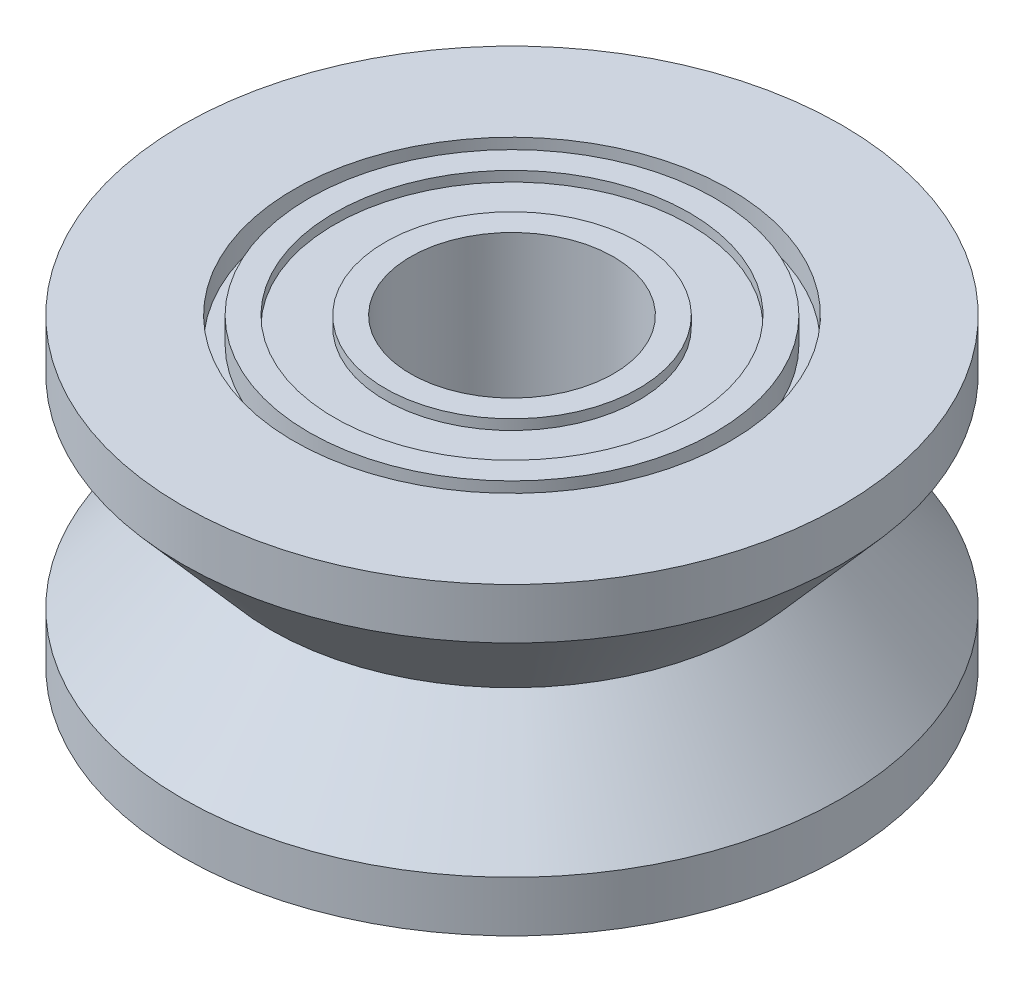
ISO-10303-21;
HEADER;
FILE_DESCRIPTION(('STEP AP214'),'2;1');
FILE_NAME('part.step','',(''),(''),'','','');
FILE_SCHEMA(('AUTOMOTIVE_DESIGN { 1 0 10303 214 1 1 1 1 }'));
ENDSEC;
DATA;
#1=APPLICATION_CONTEXT('core data for automotive mechanical design processes');
#2=APPLICATION_PROTOCOL_DEFINITION('international standard','automotive_design',2000,#1);
#3=PRODUCT_CONTEXT('',#1,'mechanical');
#4=PRODUCT('Part','Part','',(#3));
#5=PRODUCT_RELATED_PRODUCT_CATEGORY('part','',(#4));
#6=PRODUCT_DEFINITION_FORMATION('','',#4);
#7=PRODUCT_DEFINITION_CONTEXT('part definition',#1,'design');
#8=PRODUCT_DEFINITION('design','',#6,#7);
#9=PRODUCT_DEFINITION_SHAPE('','',#8);
#10=(LENGTH_UNIT() NAMED_UNIT(*) SI_UNIT(.MILLI.,.METRE.));
#11=(NAMED_UNIT(*) PLANE_ANGLE_UNIT() SI_UNIT($,.RADIAN.));
#12=(NAMED_UNIT(*) SI_UNIT($,.STERADIAN.) SOLID_ANGLE_UNIT());
#13=UNCERTAINTY_MEASURE_WITH_UNIT(LENGTH_MEASURE(1.E-05),#10,'distance_accuracy_value','');
#14=(GEOMETRIC_REPRESENTATION_CONTEXT(3) GLOBAL_UNCERTAINTY_ASSIGNED_CONTEXT((#13)) GLOBAL_UNIT_ASSIGNED_CONTEXT((#10,
#11,#12)) REPRESENTATION_CONTEXT('',''));
#15=CARTESIAN_POINT('',(0.,0.,0.));
#16=DIRECTION('',(0.,0.,1.));
#17=DIRECTION('',(1.,0.,0.));
#18=AXIS2_PLACEMENT_3D('',#15,#16,#17);
#19=CARTESIAN_POINT('',(0.,0.,0.));
#20=DIRECTION('',(0.,-1.,0.));
#21=DIRECTION('',(0.,0.,-1.));
#22=AXIS2_PLACEMENT_3D('',#19,#20,#21);
#23=CYLINDRICAL_SURFACE('',#22,2.);
#24=CARTESIAN_POINT('',(0.,-3.,0.));
#25=DIRECTION('',(0.,-1.,0.));
#26=DIRECTION('',(0.,0.,-1.));
#27=AXIS2_PLACEMENT_3D('',#24,#25,#26);
#28=CIRCLE('',#27,2.);
#29=CARTESIAN_POINT('',(0.,-3.,-2.));
#30=VERTEX_POINT('',#29);
#31=EDGE_CURVE('E124',#30,#30,#28,.T.);
#32=ORIENTED_EDGE('',*,*,#31,.T.);
#33=EDGE_LOOP('',(#32));
#34=FACE_BOUND('',#33,.T.);
#35=CARTESIAN_POINT('',(0.,-0.1,0.));
#36=DIRECTION('',(0.,1.,0.));
#37=DIRECTION('',(0.,0.,1.));
#38=AXIS2_PLACEMENT_3D('',#35,#36,#37);
#39=CIRCLE('',#38,2.);
#40=CARTESIAN_POINT('',(0.,-0.1,2.));
#41=VERTEX_POINT('',#40);
#42=EDGE_CURVE('E47',#41,#41,#39,.F.);
#43=ORIENTED_EDGE('',*,*,#42,.F.);
#44=EDGE_LOOP('',(#43));
#45=FACE_BOUND('',#44,.T.);
#46=ADVANCED_FACE('F43',(#34,#45),#23,.F.);
#47=CARTESIAN_POINT('',(-2.,3.,0.));
#48=DIRECTION('',(0.,-1.,0.));
#49=DIRECTION('',(0.,0.,-1.));
#50=AXIS2_PLACEMENT_3D('',#47,#48,#49);
#51=PLANE('',#50);
#52=CARTESIAN_POINT('',(0.,3.,0.));
#53=DIRECTION('',(0.,-1.,0.));
#54=DIRECTION('',(0.,0.,-1.));
#55=AXIS2_PLACEMENT_3D('',#52,#53,#54);
#56=CIRCLE('',#55,2.);
#57=CARTESIAN_POINT('',(0.,3.,-2.));
#58=VERTEX_POINT('',#57);
#59=EDGE_CURVE('E119',#58,#58,#56,.T.);
#60=ORIENTED_EDGE('',*,*,#59,.T.);
#61=EDGE_LOOP('',(#60));
#62=FACE_BOUND('',#61,.T.);
#63=CARTESIAN_POINT('',(0.,3.,0.));
#64=DIRECTION('',(0.,-1.,0.));
#65=DIRECTION('',(0.,0.,-1.));
#66=AXIS2_PLACEMENT_3D('',#63,#64,#65);
#67=CIRCLE('',#66,2.5);
#68=CARTESIAN_POINT('',(0.,3.,-2.5));
#69=VERTEX_POINT('',#68);
#70=EDGE_CURVE('E65',#69,#69,#67,.T.);
#71=ORIENTED_EDGE('',*,*,#70,.F.);
#72=EDGE_LOOP('',(#71));
#73=FACE_BOUND('',#72,.T.);
#74=ADVANCED_FACE('F151',(#62,#73),#51,.F.);
#75=CARTESIAN_POINT('',(0.,3.,0.));
#76=DIRECTION('',(0.,-1.,0.));
#77=DIRECTION('',(0.,0.,-1.));
#78=AXIS2_PLACEMENT_3D('',#75,#76,#77);
#79=CIRCLE('',#78,3.5);
#80=CARTESIAN_POINT('',(0.,3.,-3.5));
#81=VERTEX_POINT('',#80);
#82=EDGE_CURVE('E77',#81,#81,#79,.T.);
#83=ORIENTED_EDGE('',*,*,#82,.T.);
#84=EDGE_LOOP('',(#83));
#85=FACE_BOUND('',#84,.T.);
#86=CARTESIAN_POINT('',(0.,3.,0.));
#87=DIRECTION('',(0.,-1.,0.));
#88=DIRECTION('',(0.,0.,-1.));
#89=AXIS2_PLACEMENT_3D('',#86,#87,#88);
#90=CIRCLE('',#89,4.);
#91=CARTESIAN_POINT('',(0.,3.,-4.));
#92=VERTEX_POINT('',#91);
#93=EDGE_CURVE('E83',#92,#92,#90,.T.);
#94=ORIENTED_EDGE('',*,*,#93,.F.);
#95=EDGE_LOOP('',(#94));
#96=FACE_BOUND('',#95,.T.);
#97=ADVANCED_FACE('F152',(#85,#96),#51,.F.);
#98=CARTESIAN_POINT('',(-6.5,-3.,0.));
#99=DIRECTION('',(0.,1.,0.));
#100=DIRECTION('',(0.,0.,1.));
#101=AXIS2_PLACEMENT_3D('',#98,#99,#100);
#102=PLANE('',#101);
#103=ORIENTED_EDGE('',*,*,#31,.F.);
#104=EDGE_LOOP('',(#103));
#105=FACE_BOUND('',#104,.T.);
#106=CARTESIAN_POINT('',(0.,-3.,0.));
#107=DIRECTION('',(0.,-1.,0.));
#108=DIRECTION('',(0.,0.,-1.));
#109=AXIS2_PLACEMENT_3D('',#106,#107,#108);
#110=CIRCLE('',#109,2.5);
#111=CARTESIAN_POINT('',(0.,-3.,-2.5));
#112=VERTEX_POINT('',#111);
#113=EDGE_CURVE('E95',#112,#112,#110,.T.);
#114=ORIENTED_EDGE('',*,*,#113,.T.);
#115=EDGE_LOOP('',(#114));
#116=FACE_BOUND('',#115,.T.);
#117=ADVANCED_FACE('F177',(#105,#116),#102,.F.);
#118=CARTESIAN_POINT('',(0.,-3.,0.));
#119=DIRECTION('',(0.,-1.,0.));
#120=DIRECTION('',(0.,0.,-1.));
#121=AXIS2_PLACEMENT_3D('',#118,#119,#120);
#122=CIRCLE('',#121,3.5);
#123=CARTESIAN_POINT('',(0.,-3.,-3.5));
#124=VERTEX_POINT('',#123);
#125=EDGE_CURVE('E101',#124,#124,#122,.T.);
#126=ORIENTED_EDGE('',*,*,#125,.F.);
#127=EDGE_LOOP('',(#126));
#128=FACE_BOUND('',#127,.T.);
#129=CARTESIAN_POINT('',(0.,-3.,0.));
#130=DIRECTION('',(0.,-1.,0.));
#131=DIRECTION('',(0.,0.,-1.));
#132=AXIS2_PLACEMENT_3D('',#129,#130,#131);
#133=CIRCLE('',#132,4.);
#134=CARTESIAN_POINT('',(0.,-3.,-4.));
#135=VERTEX_POINT('',#134);
#136=EDGE_CURVE('E107',#135,#135,#133,.T.);
#137=ORIENTED_EDGE('',*,*,#136,.T.);
#138=EDGE_LOOP('',(#137));
#139=FACE_BOUND('',#138,.T.);
#140=ADVANCED_FACE('F149',(#128,#139),#102,.F.);
#141=CARTESIAN_POINT('',(0.,3.,0.));
#142=DIRECTION('',(0.,-1.,0.));
#143=DIRECTION('',(1.,0.,0.));
#144=AXIS2_PLACEMENT_3D('',#141,#142,#143);
#145=CIRCLE('',#144,4.3);
#146=CARTESIAN_POINT('',(4.3,3.,0.));
#147=VERTEX_POINT('',#146);
#148=EDGE_CURVE('E89',#147,#147,#145,.T.);
#149=ORIENTED_EDGE('',*,*,#148,.T.);
#150=EDGE_LOOP('',(#149));
#151=FACE_BOUND('',#150,.T.);
#152=CARTESIAN_POINT('',(0.,3.,0.));
#153=DIRECTION('',(0.,-1.,0.));
#154=DIRECTION('',(0.,0.,-1.));
#155=AXIS2_PLACEMENT_3D('',#152,#153,#154);
#156=CIRCLE('',#155,6.5);
#157=CARTESIAN_POINT('',(0.,3.,-6.5));
#158=VERTEX_POINT('',#157);
#159=EDGE_CURVE('E11',#158,#158,#156,.T.);
#160=ORIENTED_EDGE('',*,*,#159,.F.);
#161=EDGE_LOOP('',(#160));
#162=FACE_BOUND('',#161,.T.);
#163=ADVANCED_FACE('F45',(#151,#162),#51,.F.);
#164=CARTESIAN_POINT('',(0.,0.,0.));
#165=DIRECTION('',(0.,-1.,0.));
#166=DIRECTION('',(0.,0.,-1.));
#167=AXIS2_PLACEMENT_3D('',#164,#165,#166);
#168=CYLINDRICAL_SURFACE('',#167,6.5);
#169=CARTESIAN_POINT('',(0.,2.,0.));
#170=DIRECTION('',(0.,-1.,0.));
#171=DIRECTION('',(0.,0.,-1.));
#172=AXIS2_PLACEMENT_3D('',#169,#170,#171);
#173=CIRCLE('',#172,6.5);
#174=CARTESIAN_POINT('',(0.,2.,-6.5));
#175=VERTEX_POINT('',#174);
#176=EDGE_CURVE('E51',#175,#175,#173,.T.);
#177=ORIENTED_EDGE('',*,*,#176,.F.);
#178=EDGE_LOOP('',(#177));
#179=FACE_BOUND('',#178,.T.);
#180=ORIENTED_EDGE('',*,*,#159,.T.);
#181=EDGE_LOOP('',(#180));
#182=FACE_BOUND('',#181,.T.);
#183=ADVANCED_FACE('F140',(#179,#182),#168,.T.);
#184=CARTESIAN_POINT('',(0.,2.,0.));
#185=DIRECTION('',(0.,1.,0.));
#186=DIRECTION('',(0.,0.,1.));
#187=AXIS2_PLACEMENT_3D('',#184,#185,#186);
#188=CONICAL_SURFACE('',#187,6.5,0.718829999621624);
#189=CARTESIAN_POINT('',(0.,0.,0.));
#190=DIRECTION('',(0.,-1.,0.));
#191=DIRECTION('',(0.,0.,-1.));
#192=AXIS2_PLACEMENT_3D('',#189,#190,#191);
#193=CIRCLE('',#192,4.75);
#194=CARTESIAN_POINT('',(0.,0.,-4.75));
#195=VERTEX_POINT('',#194);
#196=EDGE_CURVE('E56',#195,#195,#193,.T.);
#197=ORIENTED_EDGE('',*,*,#196,.F.);
#198=EDGE_LOOP('',(#197));
#199=FACE_BOUND('',#198,.T.);
#200=ORIENTED_EDGE('',*,*,#176,.T.);
#201=EDGE_LOOP('',(#200));
#202=FACE_BOUND('',#201,.T.);
#203=ADVANCED_FACE('F137',(#199,#202),#188,.T.);
#204=CARTESIAN_POINT('',(0.,0.,0.));
#205=DIRECTION('',(0.,-1.,0.));
#206=DIRECTION('',(0.,0.,-1.));
#207=AXIS2_PLACEMENT_3D('',#204,#205,#206);
#208=CONICAL_SURFACE('',#207,4.75,0.718829999621624);
#209=CARTESIAN_POINT('',(0.,-2.,0.));
#210=DIRECTION('',(0.,-1.,0.));
#211=DIRECTION('',(0.,0.,-1.));
#212=AXIS2_PLACEMENT_3D('',#209,#210,#211);
#213=CIRCLE('',#212,6.5);
#214=CARTESIAN_POINT('',(0.,-2.,-6.5));
#215=VERTEX_POINT('',#214);
#216=EDGE_CURVE('E130',#215,#215,#213,.T.);
#217=ORIENTED_EDGE('',*,*,#216,.F.);
#218=EDGE_LOOP('',(#217));
#219=FACE_BOUND('',#218,.T.);
#220=ORIENTED_EDGE('',*,*,#196,.T.);
#221=EDGE_LOOP('',(#220));
#222=FACE_BOUND('',#221,.T.);
#223=ADVANCED_FACE('F135',(#219,#222),#208,.T.);
#224=CARTESIAN_POINT('',(0.,0.,0.));
#225=DIRECTION('',(0.,-1.,0.));
#226=DIRECTION('',(0.,0.,-1.));
#227=AXIS2_PLACEMENT_3D('',#224,#225,#226);
#228=CYLINDRICAL_SURFACE('',#227,6.5);
#229=CARTESIAN_POINT('',(0.,-3.,0.));
#230=DIRECTION('',(0.,-1.,0.));
#231=DIRECTION('',(0.,0.,-1.));
#232=AXIS2_PLACEMENT_3D('',#229,#230,#231);
#233=CIRCLE('',#232,6.5);
#234=CARTESIAN_POINT('',(0.,-3.,-6.5));
#235=VERTEX_POINT('',#234);
#236=EDGE_CURVE('E127',#235,#235,#233,.T.);
#237=ORIENTED_EDGE('',*,*,#236,.F.);
#238=EDGE_LOOP('',(#237));
#239=FACE_BOUND('',#238,.T.);
#240=ORIENTED_EDGE('',*,*,#216,.T.);
#241=EDGE_LOOP('',(#240));
#242=FACE_BOUND('',#241,.T.);
#243=ADVANCED_FACE('F175',(#239,#242),#228,.T.);
#244=CARTESIAN_POINT('',(0.,-3.,0.));
#245=DIRECTION('',(0.,-1.,0.));
#246=DIRECTION('',(1.,0.,0.));
#247=AXIS2_PLACEMENT_3D('',#244,#245,#246);
#248=CIRCLE('',#247,4.3);
#249=CARTESIAN_POINT('',(4.3,-3.,0.));
#250=VERTEX_POINT('',#249);
#251=EDGE_CURVE('E113',#250,#250,#248,.T.);
#252=ORIENTED_EDGE('',*,*,#251,.F.);
#253=EDGE_LOOP('',(#252));
#254=FACE_BOUND('',#253,.T.);
#255=ORIENTED_EDGE('',*,*,#236,.T.);
#256=EDGE_LOOP('',(#255));
#257=FACE_BOUND('',#256,.T.);
#258=ADVANCED_FACE('F167',(#254,#257),#102,.F.);
#259=CARTESIAN_POINT('',(0.,0.1,0.));
#260=DIRECTION('',(0.,1.,0.));
#261=DIRECTION('',(0.,0.,1.));
#262=AXIS2_PLACEMENT_3D('',#259,#260,#261);
#263=CIRCLE('',#262,2.);
#264=CARTESIAN_POINT('',(0.,0.1,2.));
#265=VERTEX_POINT('',#264);
#266=EDGE_CURVE('E59',#265,#265,#263,.F.);
#267=ORIENTED_EDGE('',*,*,#266,.T.);
#268=EDGE_LOOP('',(#267));
#269=FACE_BOUND('',#268,.T.);
#270=ORIENTED_EDGE('',*,*,#59,.F.);
#271=EDGE_LOOP('',(#270));
#272=FACE_BOUND('',#271,.T.);
#273=ADVANCED_FACE('F156',(#269,#272),#23,.F.);
#274=CARTESIAN_POINT('',(0.,-2.5,0.));
#275=DIRECTION('',(0.,-1.,0.));
#276=DIRECTION('',(0.,0.,-1.));
#277=AXIS2_PLACEMENT_3D('',#274,#275,#276);
#278=CYLINDRICAL_SURFACE('',#277,4.3);
#279=CARTESIAN_POINT('',(0.,-2.5,0.));
#280=DIRECTION('',(0.,-1.,0.));
#281=DIRECTION('',(1.,0.,0.));
#282=AXIS2_PLACEMENT_3D('',#279,#280,#281);
#283=CIRCLE('',#282,4.3);
#284=CARTESIAN_POINT('',(4.3,-2.5,0.));
#285=VERTEX_POINT('',#284);
#286=EDGE_CURVE('E116',#285,#285,#283,.T.);
#287=ORIENTED_EDGE('',*,*,#286,.F.);
#288=EDGE_LOOP('',(#287));
#289=FACE_BOUND('',#288,.T.);
#290=ORIENTED_EDGE('',*,*,#251,.T.);
#291=EDGE_LOOP('',(#290));
#292=FACE_BOUND('',#291,.T.);
#293=ADVANCED_FACE('F166',(#289,#292),#278,.F.);
#294=CARTESIAN_POINT('',(0.,-2.5,0.));
#295=DIRECTION('',(0.,-1.,0.));
#296=DIRECTION('',(0.,0.,-1.));
#297=AXIS2_PLACEMENT_3D('',#294,#295,#296);
#298=PLANE('',#297);
#299=CARTESIAN_POINT('',(0.,-2.5,0.));
#300=DIRECTION('',(0.,-1.,0.));
#301=DIRECTION('',(0.,0.,-1.));
#302=AXIS2_PLACEMENT_3D('',#299,#300,#301);
#303=CIRCLE('',#302,4.);
#304=CARTESIAN_POINT('',(0.,-2.5,-4.));
#305=VERTEX_POINT('',#304);
#306=EDGE_CURVE('E110',#305,#305,#303,.T.);
#307=ORIENTED_EDGE('',*,*,#306,.F.);
#308=EDGE_LOOP('',(#307));
#309=FACE_BOUND('',#308,.T.);
#310=ORIENTED_EDGE('',*,*,#286,.T.);
#311=EDGE_LOOP('',(#310));
#312=FACE_BOUND('',#311,.T.);
#313=ADVANCED_FACE('F172',(#309,#312),#298,.T.);
#314=CARTESIAN_POINT('',(0.,-2.5,0.));
#315=DIRECTION('',(0.,-1.,0.));
#316=DIRECTION('',(0.,0.,-1.));
#317=AXIS2_PLACEMENT_3D('',#314,#315,#316);
#318=CYLINDRICAL_SURFACE('',#317,4.);
#319=ORIENTED_EDGE('',*,*,#306,.T.);
#320=EDGE_LOOP('',(#319));
#321=FACE_BOUND('',#320,.T.);
#322=ORIENTED_EDGE('',*,*,#136,.F.);
#323=EDGE_LOOP('',(#322));
#324=FACE_BOUND('',#323,.T.);
#325=ADVANCED_FACE('F228',(#321,#324),#318,.T.);
#326=CARTESIAN_POINT('',(0.,-2.8,0.));
#327=DIRECTION('',(0.,-1.,0.));
#328=DIRECTION('',(0.,0.,-1.));
#329=AXIS2_PLACEMENT_3D('',#326,#327,#328);
#330=CYLINDRICAL_SURFACE('',#329,3.5);
#331=CARTESIAN_POINT('',(0.,-2.8,0.));
#332=DIRECTION('',(0.,-1.,0.));
#333=DIRECTION('',(0.,0.,-1.));
#334=AXIS2_PLACEMENT_3D('',#331,#332,#333);
#335=CIRCLE('',#334,3.5);
#336=CARTESIAN_POINT('',(0.,-2.8,-3.5));
#337=VERTEX_POINT('',#336);
#338=EDGE_CURVE('E104',#337,#337,#335,.T.);
#339=ORIENTED_EDGE('',*,*,#338,.F.);
#340=EDGE_LOOP('',(#339));
#341=FACE_BOUND('',#340,.T.);
#342=ORIENTED_EDGE('',*,*,#125,.T.);
#343=EDGE_LOOP('',(#342));
#344=FACE_BOUND('',#343,.T.);
#345=ADVANCED_FACE('F224',(#341,#344),#330,.F.);
#346=CARTESIAN_POINT('',(0.,-2.8,0.));
#347=DIRECTION('',(0.,-1.,0.));
#348=DIRECTION('',(0.,0.,-1.));
#349=AXIS2_PLACEMENT_3D('',#346,#347,#348);
#350=PLANE('',#349);
#351=CARTESIAN_POINT('',(0.,-2.8,0.));
#352=DIRECTION('',(0.,-1.,0.));
#353=DIRECTION('',(0.,0.,-1.));
#354=AXIS2_PLACEMENT_3D('',#351,#352,#353);
#355=CIRCLE('',#354,2.5);
#356=CARTESIAN_POINT('',(0.,-2.8,-2.5));
#357=VERTEX_POINT('',#356);
#358=EDGE_CURVE('E98',#357,#357,#355,.T.);
#359=ORIENTED_EDGE('',*,*,#358,.F.);
#360=EDGE_LOOP('',(#359));
#361=FACE_BOUND('',#360,.T.);
#362=ORIENTED_EDGE('',*,*,#338,.T.);
#363=EDGE_LOOP('',(#362));
#364=FACE_BOUND('',#363,.T.);
#365=ADVANCED_FACE('F220',(#361,#364),#350,.T.);
#366=CARTESIAN_POINT('',(0.,-2.8,0.));
#367=DIRECTION('',(0.,-1.,0.));
#368=DIRECTION('',(0.,0.,-1.));
#369=AXIS2_PLACEMENT_3D('',#366,#367,#368);
#370=CYLINDRICAL_SURFACE('',#369,2.5);
#371=ORIENTED_EDGE('',*,*,#358,.T.);
#372=EDGE_LOOP('',(#371));
#373=FACE_BOUND('',#372,.T.);
#374=ORIENTED_EDGE('',*,*,#113,.F.);
#375=EDGE_LOOP('',(#374));
#376=FACE_BOUND('',#375,.T.);
#377=ADVANCED_FACE('F213',(#373,#376),#370,.T.);
#378=CARTESIAN_POINT('',(0.,2.5,0.));
#379=DIRECTION('',(0.,-1.,0.));
#380=DIRECTION('',(0.,0.,-1.));
#381=AXIS2_PLACEMENT_3D('',#378,#379,#380);
#382=PLANE('',#381);
#383=CARTESIAN_POINT('',(0.,2.5,0.));
#384=DIRECTION('',(0.,-1.,0.));
#385=DIRECTION('',(1.,0.,0.));
#386=AXIS2_PLACEMENT_3D('',#383,#384,#385);
#387=CIRCLE('',#386,4.3);
#388=CARTESIAN_POINT('',(4.3,2.5,0.));
#389=VERTEX_POINT('',#388);
#390=EDGE_CURVE('E92',#389,#389,#387,.T.);
#391=ORIENTED_EDGE('',*,*,#390,.F.);
#392=EDGE_LOOP('',(#391));
#393=FACE_BOUND('',#392,.T.);
#394=CARTESIAN_POINT('',(0.,2.5,0.));
#395=DIRECTION('',(0.,-1.,0.));
#396=DIRECTION('',(0.,0.,-1.));
#397=AXIS2_PLACEMENT_3D('',#394,#395,#396);
#398=CIRCLE('',#397,4.);
#399=CARTESIAN_POINT('',(0.,2.5,-4.));
#400=VERTEX_POINT('',#399);
#401=EDGE_CURVE('E86',#400,#400,#398,.T.);
#402=ORIENTED_EDGE('',*,*,#401,.T.);
#403=EDGE_LOOP('',(#402));
#404=FACE_BOUND('',#403,.T.);
#405=ADVANCED_FACE('F210',(#393,#404),#382,.F.);
#406=CARTESIAN_POINT('',(0.,2.5,0.));
#407=DIRECTION('',(0.,1.,0.));
#408=DIRECTION('',(0.,0.,1.));
#409=AXIS2_PLACEMENT_3D('',#406,#407,#408);
#410=CYLINDRICAL_SURFACE('',#409,4.3);
#411=ORIENTED_EDGE('',*,*,#390,.T.);
#412=EDGE_LOOP('',(#411));
#413=FACE_BOUND('',#412,.T.);
#414=ORIENTED_EDGE('',*,*,#148,.F.);
#415=EDGE_LOOP('',(#414));
#416=FACE_BOUND('',#415,.T.);
#417=ADVANCED_FACE('F208',(#413,#416),#410,.F.);
#418=CARTESIAN_POINT('',(0.,2.5,0.));
#419=DIRECTION('',(0.,1.,0.));
#420=DIRECTION('',(0.,0.,1.));
#421=AXIS2_PLACEMENT_3D('',#418,#419,#420);
#422=CYLINDRICAL_SURFACE('',#421,4.);
#423=ORIENTED_EDGE('',*,*,#401,.F.);
#424=EDGE_LOOP('',(#423));
#425=FACE_BOUND('',#424,.T.);
#426=ORIENTED_EDGE('',*,*,#93,.T.);
#427=EDGE_LOOP('',(#426));
#428=FACE_BOUND('',#427,.T.);
#429=ADVANCED_FACE('F203',(#425,#428),#422,.T.);
#430=CARTESIAN_POINT('',(0.,2.8,0.));
#431=DIRECTION('',(0.,1.,0.));
#432=DIRECTION('',(0.,0.,-1.));
#433=AXIS2_PLACEMENT_3D('',#430,#431,#432);
#434=PLANE('',#433);
#435=CARTESIAN_POINT('',(0.,2.8,0.));
#436=DIRECTION('',(0.,-1.,0.));
#437=DIRECTION('',(0.,0.,-1.));
#438=AXIS2_PLACEMENT_3D('',#435,#436,#437);
#439=CIRCLE('',#438,3.5);
#440=CARTESIAN_POINT('',(0.,2.8,-3.5));
#441=VERTEX_POINT('',#440);
#442=EDGE_CURVE('E80',#441,#441,#439,.T.);
#443=ORIENTED_EDGE('',*,*,#442,.F.);
#444=EDGE_LOOP('',(#443));
#445=FACE_BOUND('',#444,.T.);
#446=CARTESIAN_POINT('',(0.,2.8,0.));
#447=DIRECTION('',(0.,-1.,0.));
#448=DIRECTION('',(0.,0.,-1.));
#449=AXIS2_PLACEMENT_3D('',#446,#447,#448);
#450=CIRCLE('',#449,2.5);
#451=CARTESIAN_POINT('',(0.,2.8,-2.5));
#452=VERTEX_POINT('',#451);
#453=EDGE_CURVE('E74',#452,#452,#450,.T.);
#454=ORIENTED_EDGE('',*,*,#453,.T.);
#455=EDGE_LOOP('',(#454));
#456=FACE_BOUND('',#455,.T.);
#457=ADVANCED_FACE('F194',(#445,#456),#434,.T.);
#458=CARTESIAN_POINT('',(0.,2.8,0.));
#459=DIRECTION('',(0.,1.,0.));
#460=DIRECTION('',(0.,0.,1.));
#461=AXIS2_PLACEMENT_3D('',#458,#459,#460);
#462=CYLINDRICAL_SURFACE('',#461,3.5);
#463=ORIENTED_EDGE('',*,*,#442,.T.);
#464=EDGE_LOOP('',(#463));
#465=FACE_BOUND('',#464,.T.);
#466=ORIENTED_EDGE('',*,*,#82,.F.);
#467=EDGE_LOOP('',(#466));
#468=FACE_BOUND('',#467,.T.);
#469=ADVANCED_FACE('F186',(#465,#468),#462,.F.);
#470=CARTESIAN_POINT('',(0.,2.8,0.));
#471=DIRECTION('',(0.,1.,0.));
#472=DIRECTION('',(0.,0.,1.));
#473=AXIS2_PLACEMENT_3D('',#470,#471,#472);
#474=CYLINDRICAL_SURFACE('',#473,2.5);
#475=ORIENTED_EDGE('',*,*,#453,.F.);
#476=EDGE_LOOP('',(#475));
#477=FACE_BOUND('',#476,.T.);
#478=ORIENTED_EDGE('',*,*,#70,.T.);
#479=EDGE_LOOP('',(#478));
#480=FACE_BOUND('',#479,.T.);
#481=ADVANCED_FACE('F183',(#477,#480),#474,.T.);
#482=CARTESIAN_POINT('',(0.,-0.1,0.));
#483=DIRECTION('',(0.,1.,0.));
#484=DIRECTION('',(0.,0.,1.));
#485=AXIS2_PLACEMENT_3D('',#482,#483,#484);
#486=PLANE('',#485);
#487=CARTESIAN_POINT('',(0.,-0.1,0.));
#488=DIRECTION('',(0.,1.,0.));
#489=DIRECTION('',(0.,0.,1.));
#490=AXIS2_PLACEMENT_3D('',#487,#488,#489);
#491=CIRCLE('',#490,4.);
#492=CARTESIAN_POINT('',(0.,-0.1,4.));
#493=VERTEX_POINT('',#492);
#494=EDGE_CURVE('E61',#493,#493,#491,.T.);
#495=ORIENTED_EDGE('',*,*,#494,.T.);
#496=EDGE_LOOP('',(#495));
#497=FACE_BOUND('',#496,.T.);
#498=ORIENTED_EDGE('',*,*,#42,.T.);
#499=EDGE_LOOP('',(#498));
#500=FACE_BOUND('',#499,.T.);
#501=ADVANCED_FACE('F185',(#497,#500),#486,.T.);
#502=CARTESIAN_POINT('',(0.,0.1,0.));
#503=DIRECTION('',(0.,1.,0.));
#504=DIRECTION('',(0.,0.,1.));
#505=AXIS2_PLACEMENT_3D('',#502,#503,#504);
#506=PLANE('',#505);
#507=CARTESIAN_POINT('',(0.,0.1,0.));
#508=DIRECTION('',(0.,1.,0.));
#509=DIRECTION('',(0.,0.,1.));
#510=AXIS2_PLACEMENT_3D('',#507,#508,#509);
#511=CIRCLE('',#510,4.);
#512=CARTESIAN_POINT('',(0.,0.1,4.));
#513=VERTEX_POINT('',#512);
#514=EDGE_CURVE('E67',#513,#513,#511,.T.);
#515=ORIENTED_EDGE('',*,*,#514,.F.);
#516=EDGE_LOOP('',(#515));
#517=FACE_BOUND('',#516,.T.);
#518=ORIENTED_EDGE('',*,*,#266,.F.);
#519=EDGE_LOOP('',(#518));
#520=FACE_BOUND('',#519,.T.);
#521=ADVANCED_FACE('F192',(#517,#520),#506,.F.);
#522=CARTESIAN_POINT('',(0.,-0.1,0.));
#523=DIRECTION('',(0.,1.,0.));
#524=DIRECTION('',(0.,0.,1.));
#525=AXIS2_PLACEMENT_3D('',#522,#523,#524);
#526=CYLINDRICAL_SURFACE('',#525,4.);
#527=ORIENTED_EDGE('',*,*,#494,.F.);
#528=EDGE_LOOP('',(#527));
#529=FACE_BOUND('',#528,.T.);
#530=ORIENTED_EDGE('',*,*,#514,.T.);
#531=EDGE_LOOP('',(#530));
#532=FACE_BOUND('',#531,.T.);
#533=ADVANCED_FACE('F200',(#529,#532),#526,.F.);
#534=CLOSED_SHELL('',(#46,#74,#97,#117,#140,#163,#183,#203,#223,#243,#258,#273,#293,#313,#325,
#345,#365,#377,#405,#417,#429,#457,#469,#481,#501,#521,#533));
#535=MANIFOLD_SOLID_BREP('B2',#534);
#536=ADVANCED_BREP_SHAPE_REPRESENTATION('',(#18,#535),#14);
#537=SHAPE_DEFINITION_REPRESENTATION(#9,#536);
ENDSEC;
END-ISO-10303-21;
